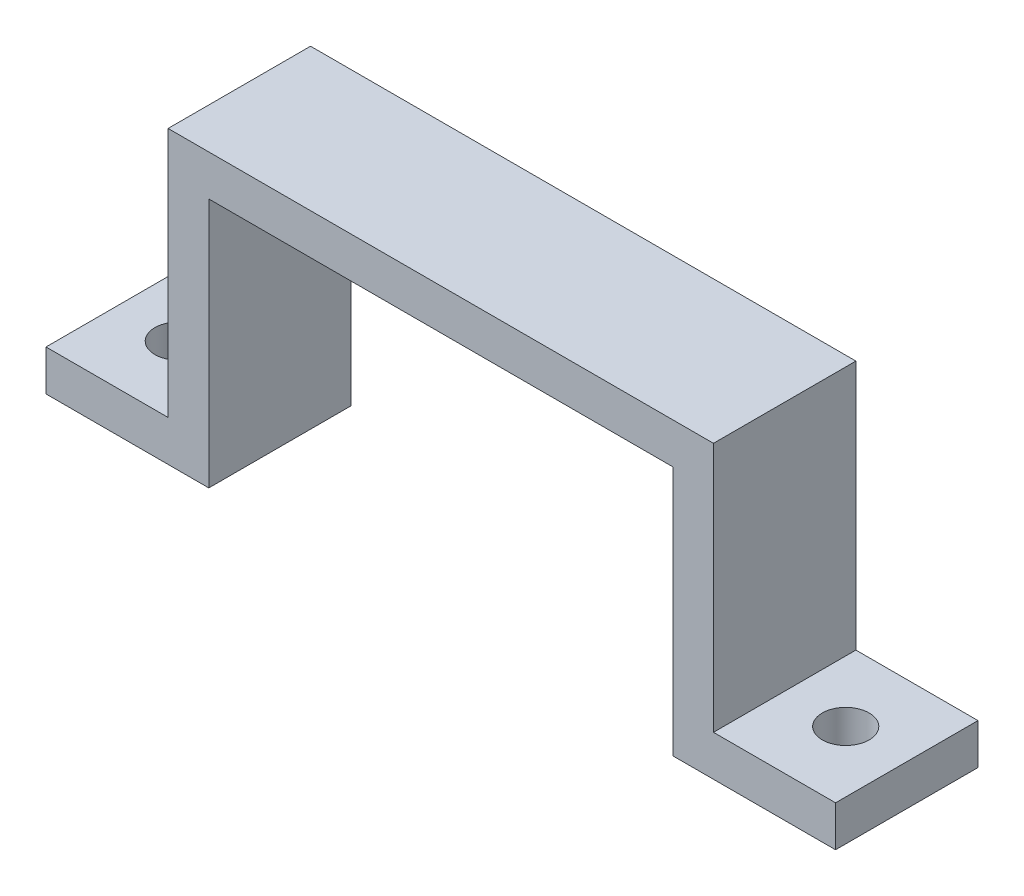
ISO-10303-21;
HEADER;
FILE_DESCRIPTION(('STEP AP214'),'2;1');
FILE_NAME('part.step','',(''),(''),'','','');
FILE_SCHEMA(('AUTOMOTIVE_DESIGN { 1 0 10303 214 1 1 1 1 }'));
ENDSEC;
DATA;
#1=APPLICATION_CONTEXT('core data for automotive mechanical design processes');
#2=APPLICATION_PROTOCOL_DEFINITION('international standard','automotive_design',2000,#1);
#3=PRODUCT_CONTEXT('',#1,'mechanical');
#4=PRODUCT('Part','Part','',(#3));
#5=PRODUCT_RELATED_PRODUCT_CATEGORY('part','',(#4));
#6=PRODUCT_DEFINITION_FORMATION('','',#4);
#7=PRODUCT_DEFINITION_CONTEXT('part definition',#1,'design');
#8=PRODUCT_DEFINITION('design','',#6,#7);
#9=PRODUCT_DEFINITION_SHAPE('','',#8);
#10=(LENGTH_UNIT() NAMED_UNIT(*) SI_UNIT(.MILLI.,.METRE.));
#11=(NAMED_UNIT(*) PLANE_ANGLE_UNIT() SI_UNIT($,.RADIAN.));
#12=(NAMED_UNIT(*) SI_UNIT($,.STERADIAN.) SOLID_ANGLE_UNIT());
#13=UNCERTAINTY_MEASURE_WITH_UNIT(LENGTH_MEASURE(1.E-05),#10,'distance_accuracy_value','');
#14=(GEOMETRIC_REPRESENTATION_CONTEXT(3) GLOBAL_UNCERTAINTY_ASSIGNED_CONTEXT((#13)) GLOBAL_UNIT_ASSIGNED_CONTEXT((#10,
#11,#12)) REPRESENTATION_CONTEXT('',''));
#15=CARTESIAN_POINT('',(0.,0.,0.));
#16=DIRECTION('',(0.,0.,1.));
#17=DIRECTION('',(1.,0.,0.));
#18=AXIS2_PLACEMENT_3D('',#15,#16,#17);
#19=CARTESIAN_POINT('',(0.,2.,7.));
#20=DIRECTION('',(1.,0.,0.));
#21=DIRECTION('',(0.,1.,0.));
#22=AXIS2_PLACEMENT_3D('',#19,#20,#21);
#23=PLANE('',#22);
#24=DIRECTION('',(0.,-1.,0.));
#25=VECTOR('',#24,1.);
#26=CARTESIAN_POINT('',(0.,2.,0.));
#27=LINE('',#26,#25);
#28=CARTESIAN_POINT('',(0.,2.,0.));
#29=VERTEX_POINT('',#28);
#30=CARTESIAN_POINT('',(0.,0.,0.));
#31=VERTEX_POINT('',#30);
#32=EDGE_CURVE('E164',#29,#31,#27,.T.);
#33=ORIENTED_EDGE('',*,*,#32,.T.);
#34=DIRECTION('',(0.,0.,-1.));
#35=VECTOR('',#34,1.);
#36=CARTESIAN_POINT('',(0.,0.,7.));
#37=LINE('',#36,#35);
#38=CARTESIAN_POINT('',(0.,0.,7.));
#39=VERTEX_POINT('',#38);
#40=EDGE_CURVE('E11',#39,#31,#37,.T.);
#41=ORIENTED_EDGE('',*,*,#40,.F.);
#42=DIRECTION('',(0.,-1.,0.));
#43=VECTOR('',#42,1.);
#44=CARTESIAN_POINT('',(0.,2.,7.));
#45=LINE('',#44,#43);
#46=CARTESIAN_POINT('',(0.,2.,7.));
#47=VERTEX_POINT('',#46);
#48=EDGE_CURVE('E199',#47,#39,#45,.T.);
#49=ORIENTED_EDGE('',*,*,#48,.F.);
#50=DIRECTION('',(0.,0.,-1.));
#51=VECTOR('',#50,1.);
#52=CARTESIAN_POINT('',(0.,2.,7.));
#53=LINE('',#52,#51);
#54=EDGE_CURVE('E160',#47,#29,#53,.T.);
#55=ORIENTED_EDGE('',*,*,#54,.T.);
#56=EDGE_LOOP('',(#33,#41,#49,#55));
#57=FACE_BOUND('',#56,.T.);
#58=ADVANCED_FACE('F39',(#57),#23,.F.);
#59=CARTESIAN_POINT('',(0.,0.,7.));
#60=DIRECTION('',(0.,1.,0.));
#61=DIRECTION('',(0.,0.,1.));
#62=AXIS2_PLACEMENT_3D('',#59,#60,#61);
#63=PLANE('',#62);
#64=CARTESIAN_POINT('',(3.,0.,3.5));
#65=DIRECTION('',(0.,1.,0.));
#66=DIRECTION('',(0.,0.,1.));
#67=AXIS2_PLACEMENT_3D('',#64,#65,#66);
#68=CIRCLE('',#67,1.15);
#69=CARTESIAN_POINT('',(3.,0.,4.65));
#70=VERTEX_POINT('',#69);
#71=EDGE_CURVE('E401',#70,#70,#68,.T.);
#72=ORIENTED_EDGE('',*,*,#71,.T.);
#73=EDGE_LOOP('',(#72));
#74=FACE_BOUND('',#73,.T.);
#75=DIRECTION('',(1.,0.,0.));
#76=VECTOR('',#75,1.);
#77=CARTESIAN_POINT('',(0.,0.,0.));
#78=LINE('',#77,#76);
#79=CARTESIAN_POINT('',(8.,0.,0.));
#80=VERTEX_POINT('',#79);
#81=EDGE_CURVE('E168',#31,#80,#78,.T.);
#82=ORIENTED_EDGE('',*,*,#81,.T.);
#83=DIRECTION('',(0.,0.,-1.));
#84=VECTOR('',#83,1.);
#85=CARTESIAN_POINT('',(8.,0.,7.));
#86=LINE('',#85,#84);
#87=CARTESIAN_POINT('',(8.,0.,7.));
#88=VERTEX_POINT('',#87);
#89=EDGE_CURVE('E48',#88,#80,#86,.T.);
#90=ORIENTED_EDGE('',*,*,#89,.F.);
#91=DIRECTION('',(1.,0.,0.));
#92=VECTOR('',#91,1.);
#93=CARTESIAN_POINT('',(0.,0.,7.));
#94=LINE('',#93,#92);
#95=EDGE_CURVE('E111',#39,#88,#94,.T.);
#96=ORIENTED_EDGE('',*,*,#95,.F.);
#97=ORIENTED_EDGE('',*,*,#40,.T.);
#98=EDGE_LOOP('',(#82,#90,#96,#97));
#99=FACE_BOUND('',#98,.T.);
#100=ADVANCED_FACE('F295',(#74,#99),#63,.F.);
#101=CARTESIAN_POINT('',(8.,0.,7.));
#102=DIRECTION('',(-1.,0.,0.));
#103=DIRECTION('',(0.,0.,1.));
#104=AXIS2_PLACEMENT_3D('',#101,#102,#103);
#105=PLANE('',#104);
#106=DIRECTION('',(0.,1.,0.));
#107=VECTOR('',#106,1.);
#108=CARTESIAN_POINT('',(8.,0.,0.));
#109=LINE('',#108,#107);
#110=CARTESIAN_POINT('',(8.,12.3,0.));
#111=VERTEX_POINT('',#110);
#112=EDGE_CURVE('E172',#80,#111,#109,.T.);
#113=ORIENTED_EDGE('',*,*,#112,.T.);
#114=DIRECTION('',(0.,0.,-1.));
#115=VECTOR('',#114,1.);
#116=CARTESIAN_POINT('',(8.,12.3,7.));
#117=LINE('',#116,#115);
#118=CARTESIAN_POINT('',(8.,12.3,7.));
#119=VERTEX_POINT('',#118);
#120=EDGE_CURVE('E226',#119,#111,#117,.T.);
#121=ORIENTED_EDGE('',*,*,#120,.F.);
#122=DIRECTION('',(0.,1.,0.));
#123=VECTOR('',#122,1.);
#124=CARTESIAN_POINT('',(8.,0.,7.));
#125=LINE('',#124,#123);
#126=EDGE_CURVE('E236',#88,#119,#125,.T.);
#127=ORIENTED_EDGE('',*,*,#126,.F.);
#128=ORIENTED_EDGE('',*,*,#89,.T.);
#129=EDGE_LOOP('',(#113,#121,#127,#128));
#130=FACE_BOUND('',#129,.T.);
#131=ADVANCED_FACE('F234',(#130),#105,.F.);
#132=CARTESIAN_POINT('',(8.,12.3,7.));
#133=DIRECTION('',(0.,1.,0.));
#134=DIRECTION('',(0.,0.,1.));
#135=AXIS2_PLACEMENT_3D('',#132,#133,#134);
#136=PLANE('',#135);
#137=DIRECTION('',(1.,0.,0.));
#138=VECTOR('',#137,1.);
#139=CARTESIAN_POINT('',(8.,12.3,0.));
#140=LINE('',#139,#138);
#141=CARTESIAN_POINT('',(30.8,12.3,0.));
#142=VERTEX_POINT('',#141);
#143=EDGE_CURVE('E175',#111,#142,#140,.T.);
#144=ORIENTED_EDGE('',*,*,#143,.T.);
#145=DIRECTION('',(0.,0.,-1.));
#146=VECTOR('',#145,1.);
#147=CARTESIAN_POINT('',(30.8,12.3,7.));
#148=LINE('',#147,#146);
#149=CARTESIAN_POINT('',(30.8,12.3,7.));
#150=VERTEX_POINT('',#149);
#151=EDGE_CURVE('E222',#150,#142,#148,.T.);
#152=ORIENTED_EDGE('',*,*,#151,.F.);
#153=DIRECTION('',(1.,0.,0.));
#154=VECTOR('',#153,1.);
#155=CARTESIAN_POINT('',(8.,12.3,7.));
#156=LINE('',#155,#154);
#157=EDGE_CURVE('E255',#119,#150,#156,.T.);
#158=ORIENTED_EDGE('',*,*,#157,.F.);
#159=ORIENTED_EDGE('',*,*,#120,.T.);
#160=EDGE_LOOP('',(#144,#152,#158,#159));
#161=FACE_BOUND('',#160,.T.);
#162=ADVANCED_FACE('F245',(#161),#136,.F.);
#163=CARTESIAN_POINT('',(30.8,12.3,7.));
#164=DIRECTION('',(1.,0.,0.));
#165=DIRECTION('',(0.,1.,0.));
#166=AXIS2_PLACEMENT_3D('',#163,#164,#165);
#167=PLANE('',#166);
#168=DIRECTION('',(0.,-1.,0.));
#169=VECTOR('',#168,1.);
#170=CARTESIAN_POINT('',(30.8,12.3,0.));
#171=LINE('',#170,#169);
#172=CARTESIAN_POINT('',(30.8,0.,0.));
#173=VERTEX_POINT('',#172);
#174=EDGE_CURVE('E178',#142,#173,#171,.T.);
#175=ORIENTED_EDGE('',*,*,#174,.T.);
#176=DIRECTION('',(0.,0.,-1.));
#177=VECTOR('',#176,1.);
#178=CARTESIAN_POINT('',(30.8,0.,7.));
#179=LINE('',#178,#177);
#180=CARTESIAN_POINT('',(30.8,0.,7.));
#181=VERTEX_POINT('',#180);
#182=EDGE_CURVE('E218',#181,#173,#179,.T.);
#183=ORIENTED_EDGE('',*,*,#182,.F.);
#184=DIRECTION('',(0.,-1.,0.));
#185=VECTOR('',#184,1.);
#186=CARTESIAN_POINT('',(30.8,12.3,7.));
#187=LINE('',#186,#185);
#188=EDGE_CURVE('E251',#150,#181,#187,.T.);
#189=ORIENTED_EDGE('',*,*,#188,.F.);
#190=ORIENTED_EDGE('',*,*,#151,.T.);
#191=EDGE_LOOP('',(#175,#183,#189,#190));
#192=FACE_BOUND('',#191,.T.);
#193=ADVANCED_FACE('F249',(#192),#167,.F.);
#194=CARTESIAN_POINT('',(30.8,0.,7.));
#195=DIRECTION('',(0.,1.,0.));
#196=DIRECTION('',(-1.,0.,0.));
#197=AXIS2_PLACEMENT_3D('',#194,#195,#196);
#198=PLANE('',#197);
#199=CARTESIAN_POINT('',(35.8,0.,3.5));
#200=DIRECTION('',(0.,1.,0.));
#201=DIRECTION('',(-1.,0.,0.));
#202=AXIS2_PLACEMENT_3D('',#199,#200,#201);
#203=CIRCLE('',#202,1.15);
#204=CARTESIAN_POINT('',(34.65,0.,3.5));
#205=VERTEX_POINT('',#204);
#206=EDGE_CURVE('E169',#205,#205,#203,.T.);
#207=ORIENTED_EDGE('',*,*,#206,.T.);
#208=EDGE_LOOP('',(#207));
#209=FACE_BOUND('',#208,.T.);
#210=DIRECTION('',(1.,0.,0.));
#211=VECTOR('',#210,1.);
#212=CARTESIAN_POINT('',(30.8,0.,0.));
#213=LINE('',#212,#211);
#214=CARTESIAN_POINT('',(38.8,0.,0.));
#215=VERTEX_POINT('',#214);
#216=EDGE_CURVE('E181',#173,#215,#213,.T.);
#217=ORIENTED_EDGE('',*,*,#216,.T.);
#218=DIRECTION('',(0.,0.,-1.));
#219=VECTOR('',#218,1.);
#220=CARTESIAN_POINT('',(38.8,0.,7.));
#221=LINE('',#220,#219);
#222=CARTESIAN_POINT('',(38.8,0.,7.));
#223=VERTEX_POINT('',#222);
#224=EDGE_CURVE('E214',#223,#215,#221,.T.);
#225=ORIENTED_EDGE('',*,*,#224,.F.);
#226=DIRECTION('',(1.,0.,0.));
#227=VECTOR('',#226,1.);
#228=CARTESIAN_POINT('',(30.8,0.,7.));
#229=LINE('',#228,#227);
#230=EDGE_CURVE('E254',#181,#223,#229,.T.);
#231=ORIENTED_EDGE('',*,*,#230,.F.);
#232=ORIENTED_EDGE('',*,*,#182,.T.);
#233=EDGE_LOOP('',(#217,#225,#231,#232));
#234=FACE_BOUND('',#233,.T.);
#235=ADVANCED_FACE('F310',(#209,#234),#198,.F.);
#236=CARTESIAN_POINT('',(38.8,0.,7.));
#237=DIRECTION('',(-1.,0.,0.));
#238=DIRECTION('',(0.,0.,1.));
#239=AXIS2_PLACEMENT_3D('',#236,#237,#238);
#240=PLANE('',#239);
#241=DIRECTION('',(0.,1.,0.));
#242=VECTOR('',#241,1.);
#243=CARTESIAN_POINT('',(38.8,0.,0.));
#244=LINE('',#243,#242);
#245=CARTESIAN_POINT('',(38.8,2.,0.));
#246=VERTEX_POINT('',#245);
#247=EDGE_CURVE('E184',#215,#246,#244,.T.);
#248=ORIENTED_EDGE('',*,*,#247,.T.);
#249=DIRECTION('',(0.,0.,-1.));
#250=VECTOR('',#249,1.);
#251=CARTESIAN_POINT('',(38.8,2.,7.));
#252=LINE('',#251,#250);
#253=CARTESIAN_POINT('',(38.8,2.,7.));
#254=VERTEX_POINT('',#253);
#255=EDGE_CURVE('E210',#254,#246,#252,.T.);
#256=ORIENTED_EDGE('',*,*,#255,.F.);
#257=DIRECTION('',(0.,1.,0.));
#258=VECTOR('',#257,1.);
#259=CARTESIAN_POINT('',(38.8,0.,7.));
#260=LINE('',#259,#258);
#261=EDGE_CURVE('E259',#223,#254,#260,.T.);
#262=ORIENTED_EDGE('',*,*,#261,.F.);
#263=ORIENTED_EDGE('',*,*,#224,.T.);
#264=EDGE_LOOP('',(#248,#256,#262,#263));
#265=FACE_BOUND('',#264,.T.);
#266=ADVANCED_FACE('F313',(#265),#240,.F.);
#267=CARTESIAN_POINT('',(38.8,2.,7.));
#268=DIRECTION('',(0.,-1.,0.));
#269=DIRECTION('',(1.,0.,0.));
#270=AXIS2_PLACEMENT_3D('',#267,#268,#269);
#271=PLANE('',#270);
#272=CARTESIAN_POINT('',(35.8,2.,3.5));
#273=DIRECTION('',(0.,1.,0.));
#274=DIRECTION('',(-1.,0.,0.));
#275=AXIS2_PLACEMENT_3D('',#272,#273,#274);
#276=CIRCLE('',#275,1.15);
#277=CARTESIAN_POINT('',(34.65,2.,3.5));
#278=VERTEX_POINT('',#277);
#279=EDGE_CURVE('E397',#278,#278,#276,.T.);
#280=ORIENTED_EDGE('',*,*,#279,.F.);
#281=EDGE_LOOP('',(#280));
#282=FACE_BOUND('',#281,.T.);
#283=DIRECTION('',(-1.,0.,0.));
#284=VECTOR('',#283,1.);
#285=CARTESIAN_POINT('',(38.8,2.,0.));
#286=LINE('',#285,#284);
#287=CARTESIAN_POINT('',(32.8,2.,0.));
#288=VERTEX_POINT('',#287);
#289=EDGE_CURVE('E187',#246,#288,#286,.T.);
#290=ORIENTED_EDGE('',*,*,#289,.T.);
#291=DIRECTION('',(0.,0.,-1.));
#292=VECTOR('',#291,1.);
#293=CARTESIAN_POINT('',(32.8,2.,7.));
#294=LINE('',#293,#292);
#295=CARTESIAN_POINT('',(32.8,2.,7.));
#296=VERTEX_POINT('',#295);
#297=EDGE_CURVE('E206',#296,#288,#294,.T.);
#298=ORIENTED_EDGE('',*,*,#297,.F.);
#299=DIRECTION('',(-1.,0.,0.));
#300=VECTOR('',#299,1.);
#301=CARTESIAN_POINT('',(38.8,2.,7.));
#302=LINE('',#301,#300);
#303=EDGE_CURVE('E266',#254,#296,#302,.T.);
#304=ORIENTED_EDGE('',*,*,#303,.F.);
#305=ORIENTED_EDGE('',*,*,#255,.T.);
#306=EDGE_LOOP('',(#290,#298,#304,#305));
#307=FACE_BOUND('',#306,.T.);
#308=ADVANCED_FACE('F274',(#282,#307),#271,.F.);
#309=CARTESIAN_POINT('',(32.8,2.,7.));
#310=DIRECTION('',(-1.,0.,0.));
#311=DIRECTION('',(0.,0.,1.));
#312=AXIS2_PLACEMENT_3D('',#309,#310,#311);
#313=PLANE('',#312);
#314=DIRECTION('',(0.,1.,0.));
#315=VECTOR('',#314,1.);
#316=CARTESIAN_POINT('',(32.8,2.,0.));
#317=LINE('',#316,#315);
#318=CARTESIAN_POINT('',(32.8,14.3,0.));
#319=VERTEX_POINT('',#318);
#320=EDGE_CURVE('E190',#288,#319,#317,.T.);
#321=ORIENTED_EDGE('',*,*,#320,.T.);
#322=DIRECTION('',(0.,0.,-1.));
#323=VECTOR('',#322,1.);
#324=CARTESIAN_POINT('',(32.8,14.3,7.));
#325=LINE('',#324,#323);
#326=CARTESIAN_POINT('',(32.8,14.3,7.));
#327=VERTEX_POINT('',#326);
#328=EDGE_CURVE('E153',#327,#319,#325,.T.);
#329=ORIENTED_EDGE('',*,*,#328,.F.);
#330=DIRECTION('',(0.,1.,0.));
#331=VECTOR('',#330,1.);
#332=CARTESIAN_POINT('',(32.8,2.,7.));
#333=LINE('',#332,#331);
#334=EDGE_CURVE('E142',#296,#327,#333,.T.);
#335=ORIENTED_EDGE('',*,*,#334,.F.);
#336=ORIENTED_EDGE('',*,*,#297,.T.);
#337=EDGE_LOOP('',(#321,#329,#335,#336));
#338=FACE_BOUND('',#337,.T.);
#339=ADVANCED_FACE('F278',(#338),#313,.F.);
#340=CARTESIAN_POINT('',(32.8,14.3,7.));
#341=DIRECTION('',(0.,-1.,0.));
#342=DIRECTION('',(1.,0.,0.));
#343=AXIS2_PLACEMENT_3D('',#340,#341,#342);
#344=PLANE('',#343);
#345=DIRECTION('',(-1.,0.,0.));
#346=VECTOR('',#345,1.);
#347=CARTESIAN_POINT('',(32.8,14.3,0.));
#348=LINE('',#347,#346);
#349=CARTESIAN_POINT('',(6.,14.3,0.));
#350=VERTEX_POINT('',#349);
#351=EDGE_CURVE('E151',#319,#350,#348,.T.);
#352=ORIENTED_EDGE('',*,*,#351,.T.);
#353=DIRECTION('',(0.,0.,-1.));
#354=VECTOR('',#353,1.);
#355=CARTESIAN_POINT('',(6.,14.3,7.));
#356=LINE('',#355,#354);
#357=CARTESIAN_POINT('',(6.,14.3,7.));
#358=VERTEX_POINT('',#357);
#359=EDGE_CURVE('E148',#358,#350,#356,.T.);
#360=ORIENTED_EDGE('',*,*,#359,.F.);
#361=DIRECTION('',(-1.,0.,0.));
#362=VECTOR('',#361,1.);
#363=CARTESIAN_POINT('',(32.8,14.3,7.));
#364=LINE('',#363,#362);
#365=EDGE_CURVE('E136',#327,#358,#364,.T.);
#366=ORIENTED_EDGE('',*,*,#365,.F.);
#367=ORIENTED_EDGE('',*,*,#328,.T.);
#368=EDGE_LOOP('',(#352,#360,#366,#367));
#369=FACE_BOUND('',#368,.T.);
#370=ADVANCED_FACE('F149',(#369),#344,.F.);
#371=CARTESIAN_POINT('',(6.,14.3,7.));
#372=DIRECTION('',(1.,0.,0.));
#373=DIRECTION('',(0.,1.,0.));
#374=AXIS2_PLACEMENT_3D('',#371,#372,#373);
#375=PLANE('',#374);
#376=DIRECTION('',(0.,-1.,0.));
#377=VECTOR('',#376,1.);
#378=CARTESIAN_POINT('',(6.,14.3,0.));
#379=LINE('',#378,#377);
#380=CARTESIAN_POINT('',(6.,2.,0.));
#381=VERTEX_POINT('',#380);
#382=EDGE_CURVE('E97',#350,#381,#379,.T.);
#383=ORIENTED_EDGE('',*,*,#382,.T.);
#384=DIRECTION('',(0.,0.,-1.));
#385=VECTOR('',#384,1.);
#386=CARTESIAN_POINT('',(6.,2.,7.));
#387=LINE('',#386,#385);
#388=CARTESIAN_POINT('',(6.,2.,7.));
#389=VERTEX_POINT('',#388);
#390=EDGE_CURVE('E154',#389,#381,#387,.T.);
#391=ORIENTED_EDGE('',*,*,#390,.F.);
#392=DIRECTION('',(0.,-1.,0.));
#393=VECTOR('',#392,1.);
#394=CARTESIAN_POINT('',(6.,14.3,7.));
#395=LINE('',#394,#393);
#396=EDGE_CURVE('E140',#358,#389,#395,.T.);
#397=ORIENTED_EDGE('',*,*,#396,.F.);
#398=ORIENTED_EDGE('',*,*,#359,.T.);
#399=EDGE_LOOP('',(#383,#391,#397,#398));
#400=FACE_BOUND('',#399,.T.);
#401=ADVANCED_FACE('F156',(#400),#375,.F.);
#402=CARTESIAN_POINT('',(6.,2.,7.));
#403=DIRECTION('',(0.,-1.,0.));
#404=DIRECTION('',(1.,0.,0.));
#405=AXIS2_PLACEMENT_3D('',#402,#403,#404);
#406=PLANE('',#405);
#407=CARTESIAN_POINT('',(3.,1.99999999999999,3.5));
#408=DIRECTION('',(0.,1.,0.));
#409=DIRECTION('',(-1.,0.,0.));
#410=AXIS2_PLACEMENT_3D('',#407,#408,#409);
#411=CIRCLE('',#410,1.15);
#412=CARTESIAN_POINT('',(1.85,1.99999999999999,3.5));
#413=VERTEX_POINT('',#412);
#414=EDGE_CURVE('E404',#413,#413,#411,.T.);
#415=ORIENTED_EDGE('',*,*,#414,.F.);
#416=EDGE_LOOP('',(#415));
#417=FACE_BOUND('',#416,.T.);
#418=DIRECTION('',(-1.,0.,0.));
#419=VECTOR('',#418,1.);
#420=CARTESIAN_POINT('',(6.,2.,0.));
#421=LINE('',#420,#419);
#422=EDGE_CURVE('E103',#381,#29,#421,.T.);
#423=ORIENTED_EDGE('',*,*,#422,.T.);
#424=ORIENTED_EDGE('',*,*,#54,.F.);
#425=DIRECTION('',(-1.,0.,0.));
#426=VECTOR('',#425,1.);
#427=CARTESIAN_POINT('',(6.,2.,7.));
#428=LINE('',#427,#426);
#429=EDGE_CURVE('E56',#389,#47,#428,.T.);
#430=ORIENTED_EDGE('',*,*,#429,.F.);
#431=ORIENTED_EDGE('',*,*,#390,.T.);
#432=EDGE_LOOP('',(#423,#424,#430,#431));
#433=FACE_BOUND('',#432,.T.);
#434=ADVANCED_FACE('F282',(#417,#433),#406,.F.);
#435=CARTESIAN_POINT('',(0.,0.,7.));
#436=DIRECTION('',(0.,0.,1.));
#437=DIRECTION('',(1.,0.,0.));
#438=AXIS2_PLACEMENT_3D('',#435,#436,#437);
#439=PLANE('',#438);
#440=ORIENTED_EDGE('',*,*,#48,.T.);
#441=ORIENTED_EDGE('',*,*,#95,.T.);
#442=ORIENTED_EDGE('',*,*,#126,.T.);
#443=ORIENTED_EDGE('',*,*,#157,.T.);
#444=ORIENTED_EDGE('',*,*,#188,.T.);
#445=ORIENTED_EDGE('',*,*,#230,.T.);
#446=ORIENTED_EDGE('',*,*,#261,.T.);
#447=ORIENTED_EDGE('',*,*,#303,.T.);
#448=ORIENTED_EDGE('',*,*,#334,.T.);
#449=ORIENTED_EDGE('',*,*,#365,.T.);
#450=ORIENTED_EDGE('',*,*,#396,.T.);
#451=ORIENTED_EDGE('',*,*,#429,.T.);
#452=EDGE_LOOP('',(#440,#441,#442,#443,#444,#445,#446,#447,#448,#449,#450,#451));
#453=FACE_BOUND('',#452,.T.);
#454=ADVANCED_FACE('F138',(#453),#439,.T.);
#455=CARTESIAN_POINT('',(0.,0.,0.));
#456=DIRECTION('',(0.,0.,1.));
#457=DIRECTION('',(1.,0.,0.));
#458=AXIS2_PLACEMENT_3D('',#455,#456,#457);
#459=PLANE('',#458);
#460=ORIENTED_EDGE('',*,*,#32,.F.);
#461=ORIENTED_EDGE('',*,*,#422,.F.);
#462=ORIENTED_EDGE('',*,*,#382,.F.);
#463=ORIENTED_EDGE('',*,*,#351,.F.);
#464=ORIENTED_EDGE('',*,*,#320,.F.);
#465=ORIENTED_EDGE('',*,*,#289,.F.);
#466=ORIENTED_EDGE('',*,*,#247,.F.);
#467=ORIENTED_EDGE('',*,*,#216,.F.);
#468=ORIENTED_EDGE('',*,*,#174,.F.);
#469=ORIENTED_EDGE('',*,*,#143,.F.);
#470=ORIENTED_EDGE('',*,*,#112,.F.);
#471=ORIENTED_EDGE('',*,*,#81,.F.);
#472=EDGE_LOOP('',(#460,#461,#462,#463,#464,#465,#466,#467,#468,#469,#470,#471));
#473=FACE_BOUND('',#472,.T.);
#474=ADVANCED_FACE('F240',(#473),#459,.F.);
#475=CARTESIAN_POINT('',(3.,-5.00000000000001,3.5));
#476=DIRECTION('',(0.,1.,0.));
#477=DIRECTION('',(-1.,0.,0.));
#478=AXIS2_PLACEMENT_3D('',#475,#476,#477);
#479=CYLINDRICAL_SURFACE('',#478,1.15);
#480=ORIENTED_EDGE('',*,*,#414,.T.);
#481=EDGE_LOOP('',(#480));
#482=FACE_BOUND('',#481,.T.);
#483=ORIENTED_EDGE('',*,*,#71,.F.);
#484=EDGE_LOOP('',(#483));
#485=FACE_BOUND('',#484,.T.);
#486=ADVANCED_FACE('F347',(#482,#485),#479,.F.);
#487=CARTESIAN_POINT('',(35.8,-5.,3.5));
#488=DIRECTION('',(0.,1.,0.));
#489=DIRECTION('',(-1.,0.,0.));
#490=AXIS2_PLACEMENT_3D('',#487,#488,#489);
#491=CYLINDRICAL_SURFACE('',#490,1.15);
#492=ORIENTED_EDGE('',*,*,#279,.T.);
#493=EDGE_LOOP('',(#492));
#494=FACE_BOUND('',#493,.T.);
#495=ORIENTED_EDGE('',*,*,#206,.F.);
#496=EDGE_LOOP('',(#495));
#497=FACE_BOUND('',#496,.T.);
#498=ADVANCED_FACE('F380',(#494,#497),#491,.F.);
#499=CLOSED_SHELL('',(#58,#100,#131,#162,#193,#235,#266,#308,#339,#370,#401,#434,#454,#474,#486,#498));
#500=MANIFOLD_SOLID_BREP('B2',#499);
#501=ADVANCED_BREP_SHAPE_REPRESENTATION('',(#18,#500),#14);
#502=SHAPE_DEFINITION_REPRESENTATION(#9,#501);
ENDSEC;
END-ISO-10303-21;
